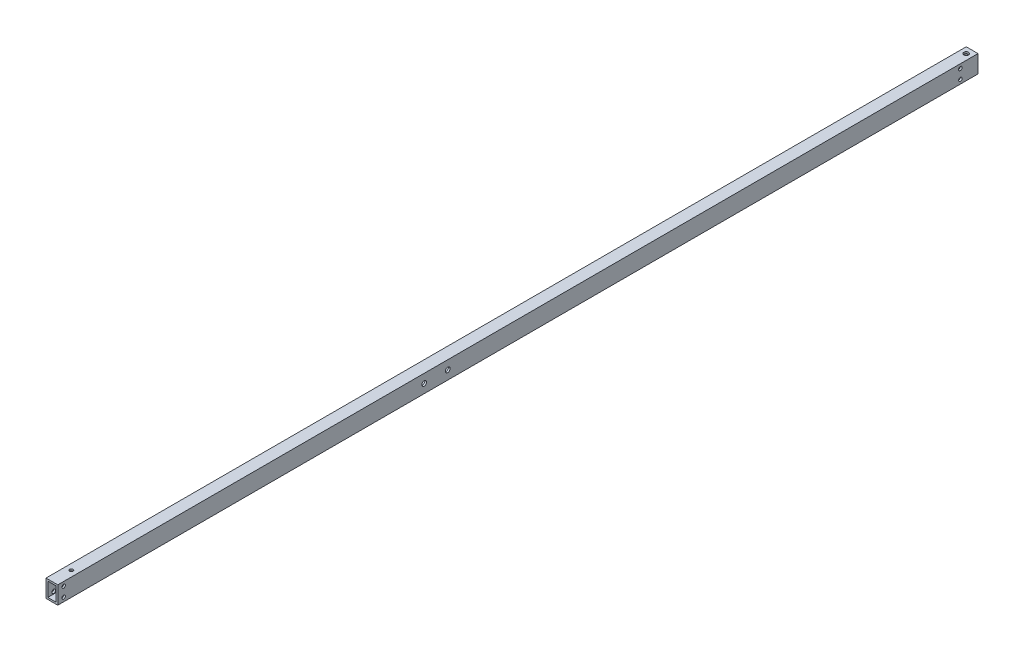
ISO-10303-21;
HEADER;
FILE_DESCRIPTION(('STEP AP214'),'2;1');
FILE_NAME('part.step','',(''),(''),'','','');
FILE_SCHEMA(('AUTOMOTIVE_DESIGN { 1 0 10303 214 1 1 1 1 }'));
ENDSEC;
DATA;
#1=APPLICATION_CONTEXT('core data for automotive mechanical design processes');
#2=APPLICATION_PROTOCOL_DEFINITION('international standard','automotive_design',2000,#1);
#3=PRODUCT_CONTEXT('',#1,'mechanical');
#4=PRODUCT('Part','Part','',(#3));
#5=PRODUCT_RELATED_PRODUCT_CATEGORY('part','',(#4));
#6=PRODUCT_DEFINITION_FORMATION('','',#4);
#7=PRODUCT_DEFINITION_CONTEXT('part definition',#1,'design');
#8=PRODUCT_DEFINITION('design','',#6,#7);
#9=PRODUCT_DEFINITION_SHAPE('','',#8);
#10=(LENGTH_UNIT() NAMED_UNIT(*) SI_UNIT(.MILLI.,.METRE.));
#11=(NAMED_UNIT(*) PLANE_ANGLE_UNIT() SI_UNIT($,.RADIAN.));
#12=(NAMED_UNIT(*) SI_UNIT($,.STERADIAN.) SOLID_ANGLE_UNIT());
#13=UNCERTAINTY_MEASURE_WITH_UNIT(LENGTH_MEASURE(1.E-05),#10,'distance_accuracy_value','');
#14=(GEOMETRIC_REPRESENTATION_CONTEXT(3) GLOBAL_UNCERTAINTY_ASSIGNED_CONTEXT((#13)) GLOBAL_UNIT_ASSIGNED_CONTEXT((#10,
#11,#12)) REPRESENTATION_CONTEXT('',''));
#15=CARTESIAN_POINT('',(0.,0.,0.));
#16=DIRECTION('',(0.,0.,1.));
#17=DIRECTION('',(1.,0.,0.));
#18=AXIS2_PLACEMENT_3D('',#15,#16,#17);
#19=CARTESIAN_POINT('',(0.,0.,781.));
#20=DIRECTION('',(0.,0.,1.));
#21=DIRECTION('',(1.,0.,0.));
#22=AXIS2_PLACEMENT_3D('',#19,#20,#21);
#23=PLANE('',#22);
#24=DIRECTION('',(0.,1.,0.));
#25=VECTOR('',#24,1.);
#26=CARTESIAN_POINT('',(5.,-7.5,781.));
#27=LINE('',#26,#25);
#28=CARTESIAN_POINT('',(5.,-7.5,781.));
#29=VERTEX_POINT('',#28);
#30=CARTESIAN_POINT('',(5.,7.5,781.));
#31=VERTEX_POINT('',#30);
#32=EDGE_CURVE('E164',#29,#31,#27,.T.);
#33=ORIENTED_EDGE('',*,*,#32,.T.);
#34=DIRECTION('',(-1.,0.,0.));
#35=VECTOR('',#34,1.);
#36=CARTESIAN_POINT('',(-5.,7.5,781.));
#37=LINE('',#36,#35);
#38=CARTESIAN_POINT('',(-5.,7.5,781.));
#39=VERTEX_POINT('',#38);
#40=EDGE_CURVE('E167',#31,#39,#37,.T.);
#41=ORIENTED_EDGE('',*,*,#40,.T.);
#42=DIRECTION('',(0.,-1.,0.));
#43=VECTOR('',#42,1.);
#44=CARTESIAN_POINT('',(-5.,-7.5,781.));
#45=LINE('',#44,#43);
#46=CARTESIAN_POINT('',(-5.,-7.5,781.));
#47=VERTEX_POINT('',#46);
#48=EDGE_CURVE('E170',#39,#47,#45,.T.);
#49=ORIENTED_EDGE('',*,*,#48,.T.);
#50=DIRECTION('',(1.,0.,0.));
#51=VECTOR('',#50,1.);
#52=CARTESIAN_POINT('',(-5.,-7.5,781.));
#53=LINE('',#52,#51);
#54=EDGE_CURVE('E172',#47,#29,#53,.T.);
#55=ORIENTED_EDGE('',*,*,#54,.T.);
#56=EDGE_LOOP('',(#33,#41,#49,#55));
#57=FACE_BOUND('',#56,.T.);
#58=DIRECTION('',(-1.,0.,0.));
#59=VECTOR('',#58,1.);
#60=CARTESIAN_POINT('',(0.,6.,781.));
#61=LINE('',#60,#59);
#62=CARTESIAN_POINT('',(3.5,6.,781.));
#63=VERTEX_POINT('',#62);
#64=CARTESIAN_POINT('',(-3.5,6.,781.));
#65=VERTEX_POINT('',#64);
#66=EDGE_CURVE('E134',#63,#65,#61,.T.);
#67=ORIENTED_EDGE('',*,*,#66,.F.);
#68=DIRECTION('',(0.,1.,0.));
#69=VECTOR('',#68,1.);
#70=CARTESIAN_POINT('',(3.5,0.,781.));
#71=LINE('',#70,#69);
#72=CARTESIAN_POINT('',(3.5,-6.,781.));
#73=VERTEX_POINT('',#72);
#74=EDGE_CURVE('E126',#73,#63,#71,.T.);
#75=ORIENTED_EDGE('',*,*,#74,.F.);
#76=DIRECTION('',(1.,0.,0.));
#77=VECTOR('',#76,1.);
#78=CARTESIAN_POINT('',(0.,-6.,781.));
#79=LINE('',#78,#77);
#80=CARTESIAN_POINT('',(-3.5,-6.,781.));
#81=VERTEX_POINT('',#80);
#82=EDGE_CURVE('E148',#81,#73,#79,.T.);
#83=ORIENTED_EDGE('',*,*,#82,.F.);
#84=DIRECTION('',(0.,-1.,0.));
#85=VECTOR('',#84,1.);
#86=CARTESIAN_POINT('',(-3.5,0.,781.));
#87=LINE('',#86,#85);
#88=EDGE_CURVE('E146',#65,#81,#87,.T.);
#89=ORIENTED_EDGE('',*,*,#88,.F.);
#90=EDGE_LOOP('',(#67,#75,#83,#89));
#91=FACE_BOUND('',#90,.T.);
#92=ADVANCED_FACE('F59',(#57,#91),#23,.T.);
#93=CARTESIAN_POINT('',(0.,0.,0.));
#94=DIRECTION('',(0.,0.,1.));
#95=DIRECTION('',(1.,0.,0.));
#96=AXIS2_PLACEMENT_3D('',#93,#94,#95);
#97=PLANE('',#96);
#98=DIRECTION('',(0.,1.,0.));
#99=VECTOR('',#98,1.);
#100=CARTESIAN_POINT('',(5.,-7.5,0.));
#101=LINE('',#100,#99);
#102=CARTESIAN_POINT('',(5.,-7.5,0.));
#103=VERTEX_POINT('',#102);
#104=CARTESIAN_POINT('',(5.,7.5,0.));
#105=VERTEX_POINT('',#104);
#106=EDGE_CURVE('E142',#103,#105,#101,.T.);
#107=ORIENTED_EDGE('',*,*,#106,.F.);
#108=DIRECTION('',(1.,0.,0.));
#109=VECTOR('',#108,1.);
#110=CARTESIAN_POINT('',(-5.,-7.5,0.));
#111=LINE('',#110,#109);
#112=CARTESIAN_POINT('',(-5.,-7.5,0.));
#113=VERTEX_POINT('',#112);
#114=EDGE_CURVE('E168',#113,#103,#111,.T.);
#115=ORIENTED_EDGE('',*,*,#114,.F.);
#116=DIRECTION('',(0.,-1.,0.));
#117=VECTOR('',#116,1.);
#118=CARTESIAN_POINT('',(-5.,-7.5,0.));
#119=LINE('',#118,#117);
#120=CARTESIAN_POINT('',(-5.,7.5,0.));
#121=VERTEX_POINT('',#120);
#122=EDGE_CURVE('E179',#121,#113,#119,.T.);
#123=ORIENTED_EDGE('',*,*,#122,.F.);
#124=DIRECTION('',(-1.,0.,0.));
#125=VECTOR('',#124,1.);
#126=CARTESIAN_POINT('',(-5.,7.5,0.));
#127=LINE('',#126,#125);
#128=EDGE_CURVE('E177',#105,#121,#127,.T.);
#129=ORIENTED_EDGE('',*,*,#128,.F.);
#130=EDGE_LOOP('',(#107,#115,#123,#129));
#131=FACE_BOUND('',#130,.T.);
#132=DIRECTION('',(0.,1.,0.));
#133=VECTOR('',#132,1.);
#134=CARTESIAN_POINT('',(3.5,0.,0.));
#135=LINE('',#134,#133);
#136=CARTESIAN_POINT('',(3.5,-6.,0.));
#137=VERTEX_POINT('',#136);
#138=CARTESIAN_POINT('',(3.5,6.,0.));
#139=VERTEX_POINT('',#138);
#140=EDGE_CURVE('E84',#137,#139,#135,.T.);
#141=ORIENTED_EDGE('',*,*,#140,.T.);
#142=DIRECTION('',(-1.,0.,0.));
#143=VECTOR('',#142,1.);
#144=CARTESIAN_POINT('',(0.,6.,0.));
#145=LINE('',#144,#143);
#146=CARTESIAN_POINT('',(-3.5,6.,0.));
#147=VERTEX_POINT('',#146);
#148=EDGE_CURVE('E141',#139,#147,#145,.T.);
#149=ORIENTED_EDGE('',*,*,#148,.T.);
#150=DIRECTION('',(0.,-1.,0.));
#151=VECTOR('',#150,1.);
#152=CARTESIAN_POINT('',(-3.5,0.,0.));
#153=LINE('',#152,#151);
#154=CARTESIAN_POINT('',(-3.5,-6.,0.));
#155=VERTEX_POINT('',#154);
#156=EDGE_CURVE('E156',#147,#155,#153,.T.);
#157=ORIENTED_EDGE('',*,*,#156,.T.);
#158=DIRECTION('',(1.,0.,0.));
#159=VECTOR('',#158,1.);
#160=CARTESIAN_POINT('',(0.,-6.,0.));
#161=LINE('',#160,#159);
#162=EDGE_CURVE('E135',#155,#137,#161,.T.);
#163=ORIENTED_EDGE('',*,*,#162,.T.);
#164=EDGE_LOOP('',(#141,#149,#157,#163));
#165=FACE_BOUND('',#164,.T.);
#166=ADVANCED_FACE('F313',(#131,#165),#97,.F.);
#167=CARTESIAN_POINT('',(5.,-7.5,781.));
#168=DIRECTION('',(-1.,0.,0.));
#169=DIRECTION('',(0.,0.,1.));
#170=AXIS2_PLACEMENT_3D('',#167,#168,#169);
#171=PLANE('',#170);
#172=CARTESIAN_POINT('',(5.,4.,15.));
#173=DIRECTION('',(1.,0.,0.));
#174=DIRECTION('',(0.,0.,-1.));
#175=AXIS2_PLACEMENT_3D('',#172,#173,#174);
#176=CIRCLE('',#175,1.5);
#177=CARTESIAN_POINT('',(5.,4.,13.5));
#178=VERTEX_POINT('',#177);
#179=EDGE_CURVE('E248',#178,#178,#176,.T.);
#180=ORIENTED_EDGE('',*,*,#179,.F.);
#181=EDGE_LOOP('',(#180));
#182=FACE_BOUND('',#181,.T.);
#183=CARTESIAN_POINT('',(5.,-4.,15.));
#184=DIRECTION('',(1.,0.,0.));
#185=DIRECTION('',(0.,0.,1.));
#186=AXIS2_PLACEMENT_3D('',#183,#184,#185);
#187=CIRCLE('',#186,1.5);
#188=CARTESIAN_POINT('',(5.,-4.,16.5));
#189=VERTEX_POINT('',#188);
#190=EDGE_CURVE('E254',#189,#189,#187,.T.);
#191=ORIENTED_EDGE('',*,*,#190,.F.);
#192=EDGE_LOOP('',(#191));
#193=FACE_BOUND('',#192,.T.);
#194=CARTESIAN_POINT('',(5.,0.,470.));
#195=DIRECTION('',(1.,0.,0.));
#196=DIRECTION('',(0.,0.,-1.));
#197=AXIS2_PLACEMENT_3D('',#194,#195,#196);
#198=CIRCLE('',#197,2.);
#199=CARTESIAN_POINT('',(5.,0.,468.));
#200=VERTEX_POINT('',#199);
#201=EDGE_CURVE('E260',#200,#200,#198,.T.);
#202=ORIENTED_EDGE('',*,*,#201,.F.);
#203=EDGE_LOOP('',(#202));
#204=FACE_BOUND('',#203,.T.);
#205=CARTESIAN_POINT('',(5.,-4.,776.));
#206=DIRECTION('',(1.,0.,0.));
#207=DIRECTION('',(0.,0.,1.));
#208=AXIS2_PLACEMENT_3D('',#205,#206,#207);
#209=CIRCLE('',#208,1.49999999999997);
#210=CARTESIAN_POINT('',(5.,-4.,777.5));
#211=VERTEX_POINT('',#210);
#212=EDGE_CURVE('E241',#211,#211,#209,.T.);
#213=ORIENTED_EDGE('',*,*,#212,.F.);
#214=EDGE_LOOP('',(#213));
#215=FACE_BOUND('',#214,.T.);
#216=CARTESIAN_POINT('',(5.,0.,450.));
#217=DIRECTION('',(1.,0.,0.));
#218=DIRECTION('',(0.,0.,-1.));
#219=AXIS2_PLACEMENT_3D('',#216,#217,#218);
#220=CIRCLE('',#219,2.);
#221=CARTESIAN_POINT('',(5.,0.,448.));
#222=VERTEX_POINT('',#221);
#223=EDGE_CURVE('E237',#222,#222,#220,.T.);
#224=ORIENTED_EDGE('',*,*,#223,.F.);
#225=EDGE_LOOP('',(#224));
#226=FACE_BOUND('',#225,.T.);
#227=CARTESIAN_POINT('',(5.,4.,776.));
#228=DIRECTION('',(1.,0.,0.));
#229=DIRECTION('',(0.,0.,-1.));
#230=AXIS2_PLACEMENT_3D('',#227,#228,#229);
#231=CIRCLE('',#230,1.49999999999997);
#232=CARTESIAN_POINT('',(5.,4.,774.5));
#233=VERTEX_POINT('',#232);
#234=EDGE_CURVE('E247',#233,#233,#231,.T.);
#235=ORIENTED_EDGE('',*,*,#234,.F.);
#236=EDGE_LOOP('',(#235));
#237=FACE_BOUND('',#236,.T.);
#238=ORIENTED_EDGE('',*,*,#106,.T.);
#239=DIRECTION('',(0.,0.,-1.));
#240=VECTOR('',#239,1.);
#241=CARTESIAN_POINT('',(5.,7.5,781.));
#242=LINE('',#241,#240);
#243=EDGE_CURVE('E12',#31,#105,#242,.T.);
#244=ORIENTED_EDGE('',*,*,#243,.F.);
#245=ORIENTED_EDGE('',*,*,#32,.F.);
#246=DIRECTION('',(0.,0.,-1.));
#247=VECTOR('',#246,1.);
#248=CARTESIAN_POINT('',(5.,-7.5,781.));
#249=LINE('',#248,#247);
#250=EDGE_CURVE('E174',#29,#103,#249,.T.);
#251=ORIENTED_EDGE('',*,*,#250,.T.);
#252=EDGE_LOOP('',(#238,#244,#245,#251));
#253=FACE_BOUND('',#252,.T.);
#254=ADVANCED_FACE('F61',(#182,#193,#204,#215,#226,#237,#253),#171,.F.);
#255=CARTESIAN_POINT('',(-5.,7.5,781.));
#256=DIRECTION('',(0.,-1.,0.));
#257=DIRECTION('',(0.,0.,-1.));
#258=AXIS2_PLACEMENT_3D('',#255,#256,#257);
#259=PLANE('',#258);
#260=CARTESIAN_POINT('',(0.,7.5,5.));
#261=DIRECTION('',(0.,1.,0.));
#262=DIRECTION('',(0.,0.,1.));
#263=AXIS2_PLACEMENT_3D('',#260,#261,#262);
#264=CIRCLE('',#263,2.);
#265=CARTESIAN_POINT('',(0.,7.5,7.));
#266=VERTEX_POINT('',#265);
#267=EDGE_CURVE('E221',#266,#266,#264,.T.);
#268=ORIENTED_EDGE('',*,*,#267,.F.);
#269=EDGE_LOOP('',(#268));
#270=FACE_BOUND('',#269,.T.);
#271=CARTESIAN_POINT('',(0.,7.5,764.5));
#272=DIRECTION('',(0.,1.,0.));
#273=DIRECTION('',(0.,0.,1.));
#274=AXIS2_PLACEMENT_3D('',#271,#272,#273);
#275=CIRCLE('',#274,1.5);
#276=CARTESIAN_POINT('',(0.,7.5,766.));
#277=VERTEX_POINT('',#276);
#278=EDGE_CURVE('E231',#277,#277,#275,.T.);
#279=ORIENTED_EDGE('',*,*,#278,.F.);
#280=EDGE_LOOP('',(#279));
#281=FACE_BOUND('',#280,.T.);
#282=ORIENTED_EDGE('',*,*,#128,.T.);
#283=DIRECTION('',(0.,0.,-1.));
#284=VECTOR('',#283,1.);
#285=CARTESIAN_POINT('',(-5.,7.5,781.));
#286=LINE('',#285,#284);
#287=EDGE_CURVE('E68',#39,#121,#286,.T.);
#288=ORIENTED_EDGE('',*,*,#287,.F.);
#289=ORIENTED_EDGE('',*,*,#40,.F.);
#290=ORIENTED_EDGE('',*,*,#243,.T.);
#291=EDGE_LOOP('',(#282,#288,#289,#290));
#292=FACE_BOUND('',#291,.T.);
#293=ADVANCED_FACE('F312',(#270,#281,#292),#259,.F.);
#294=CARTESIAN_POINT('',(-5.,-7.5,781.));
#295=DIRECTION('',(1.,0.,0.));
#296=DIRECTION('',(0.,0.,-1.));
#297=AXIS2_PLACEMENT_3D('',#294,#295,#296);
#298=PLANE('',#297);
#299=CARTESIAN_POINT('',(-5.,4.,15.));
#300=DIRECTION('',(1.,0.,0.));
#301=DIRECTION('',(0.,0.,-1.));
#302=AXIS2_PLACEMENT_3D('',#299,#300,#301);
#303=CIRCLE('',#302,1.5);
#304=CARTESIAN_POINT('',(-5.,4.,13.5));
#305=VERTEX_POINT('',#304);
#306=EDGE_CURVE('E244',#305,#305,#303,.T.);
#307=ORIENTED_EDGE('',*,*,#306,.T.);
#308=EDGE_LOOP('',(#307));
#309=FACE_BOUND('',#308,.T.);
#310=CARTESIAN_POINT('',(-5.,-4.,15.));
#311=DIRECTION('',(1.,0.,0.));
#312=DIRECTION('',(0.,0.,1.));
#313=AXIS2_PLACEMENT_3D('',#310,#311,#312);
#314=CIRCLE('',#313,1.5);
#315=CARTESIAN_POINT('',(-5.,-4.,16.5));
#316=VERTEX_POINT('',#315);
#317=EDGE_CURVE('E251',#316,#316,#314,.T.);
#318=ORIENTED_EDGE('',*,*,#317,.T.);
#319=EDGE_LOOP('',(#318));
#320=FACE_BOUND('',#319,.T.);
#321=CARTESIAN_POINT('',(-5.,0.,470.));
#322=DIRECTION('',(1.,0.,0.));
#323=DIRECTION('',(0.,0.,-1.));
#324=AXIS2_PLACEMENT_3D('',#321,#322,#323);
#325=CIRCLE('',#324,2.);
#326=CARTESIAN_POINT('',(-5.,0.,468.));
#327=VERTEX_POINT('',#326);
#328=EDGE_CURVE('E257',#327,#327,#325,.T.);
#329=ORIENTED_EDGE('',*,*,#328,.T.);
#330=EDGE_LOOP('',(#329));
#331=FACE_BOUND('',#330,.T.);
#332=CARTESIAN_POINT('',(-5.,-4.,776.));
#333=DIRECTION('',(1.,0.,0.));
#334=DIRECTION('',(0.,0.,1.));
#335=AXIS2_PLACEMENT_3D('',#332,#333,#334);
#336=CIRCLE('',#335,1.49999999999997);
#337=CARTESIAN_POINT('',(-5.,-4.,777.5));
#338=VERTEX_POINT('',#337);
#339=EDGE_CURVE('E263',#338,#338,#336,.T.);
#340=ORIENTED_EDGE('',*,*,#339,.T.);
#341=EDGE_LOOP('',(#340));
#342=FACE_BOUND('',#341,.T.);
#343=CARTESIAN_POINT('',(-5.,0.,450.));
#344=DIRECTION('',(1.,0.,0.));
#345=DIRECTION('',(0.,0.,-1.));
#346=AXIS2_PLACEMENT_3D('',#343,#344,#345);
#347=CIRCLE('',#346,2.);
#348=CARTESIAN_POINT('',(-5.,0.,448.));
#349=VERTEX_POINT('',#348);
#350=EDGE_CURVE('E238',#349,#349,#347,.T.);
#351=ORIENTED_EDGE('',*,*,#350,.T.);
#352=EDGE_LOOP('',(#351));
#353=FACE_BOUND('',#352,.T.);
#354=CARTESIAN_POINT('',(-5.,4.,776.));
#355=DIRECTION('',(1.,0.,0.));
#356=DIRECTION('',(0.,0.,-1.));
#357=AXIS2_PLACEMENT_3D('',#354,#355,#356);
#358=CIRCLE('',#357,1.49999999999997);
#359=CARTESIAN_POINT('',(-5.,4.,774.5));
#360=VERTEX_POINT('',#359);
#361=EDGE_CURVE('E193',#360,#360,#358,.T.);
#362=ORIENTED_EDGE('',*,*,#361,.T.);
#363=EDGE_LOOP('',(#362));
#364=FACE_BOUND('',#363,.T.);
#365=ORIENTED_EDGE('',*,*,#122,.T.);
#366=DIRECTION('',(0.,0.,-1.));
#367=VECTOR('',#366,1.);
#368=CARTESIAN_POINT('',(-5.,-7.5,781.));
#369=LINE('',#368,#367);
#370=EDGE_CURVE('E184',#47,#113,#369,.T.);
#371=ORIENTED_EDGE('',*,*,#370,.F.);
#372=ORIENTED_EDGE('',*,*,#48,.F.);
#373=ORIENTED_EDGE('',*,*,#287,.T.);
#374=EDGE_LOOP('',(#365,#371,#372,#373));
#375=FACE_BOUND('',#374,.T.);
#376=ADVANCED_FACE('F331',(#309,#320,#331,#342,#353,#364,#375),#298,.F.);
#377=CARTESIAN_POINT('',(-5.,-7.5,781.));
#378=DIRECTION('',(0.,1.,0.));
#379=DIRECTION('',(0.,0.,1.));
#380=AXIS2_PLACEMENT_3D('',#377,#378,#379);
#381=PLANE('',#380);
#382=CARTESIAN_POINT('',(0.,-7.5,5.));
#383=DIRECTION('',(0.,1.,0.));
#384=DIRECTION('',(0.,0.,1.));
#385=AXIS2_PLACEMENT_3D('',#382,#383,#384);
#386=CIRCLE('',#385,2.);
#387=CARTESIAN_POINT('',(0.,-7.5,7.));
#388=VERTEX_POINT('',#387);
#389=EDGE_CURVE('E215',#388,#388,#386,.T.);
#390=ORIENTED_EDGE('',*,*,#389,.T.);
#391=EDGE_LOOP('',(#390));
#392=FACE_BOUND('',#391,.T.);
#393=CARTESIAN_POINT('',(0.,-7.5,764.5));
#394=DIRECTION('',(0.,1.,0.));
#395=DIRECTION('',(0.,0.,1.));
#396=AXIS2_PLACEMENT_3D('',#393,#394,#395);
#397=CIRCLE('',#396,1.5);
#398=CARTESIAN_POINT('',(0.,-7.5,766.));
#399=VERTEX_POINT('',#398);
#400=EDGE_CURVE('E226',#399,#399,#397,.T.);
#401=ORIENTED_EDGE('',*,*,#400,.T.);
#402=EDGE_LOOP('',(#401));
#403=FACE_BOUND('',#402,.T.);
#404=ORIENTED_EDGE('',*,*,#114,.T.);
#405=ORIENTED_EDGE('',*,*,#250,.F.);
#406=ORIENTED_EDGE('',*,*,#54,.F.);
#407=ORIENTED_EDGE('',*,*,#370,.T.);
#408=EDGE_LOOP('',(#404,#405,#406,#407));
#409=FACE_BOUND('',#408,.T.);
#410=ADVANCED_FACE('F289',(#392,#403,#409),#381,.F.);
#411=CARTESIAN_POINT('',(3.5,0.,781.));
#412=DIRECTION('',(-1.,0.,0.));
#413=DIRECTION('',(0.,0.,1.));
#414=AXIS2_PLACEMENT_3D('',#411,#412,#413);
#415=PLANE('',#414);
#416=CARTESIAN_POINT('',(3.5,4.,15.));
#417=DIRECTION('',(-1.,0.,0.));
#418=DIRECTION('',(0.,0.,1.));
#419=AXIS2_PLACEMENT_3D('',#416,#417,#418);
#420=CIRCLE('',#419,1.5);
#421=CARTESIAN_POINT('',(3.5,4.,16.5));
#422=VERTEX_POINT('',#421);
#423=EDGE_CURVE('E154',#422,#422,#420,.T.);
#424=ORIENTED_EDGE('',*,*,#423,.F.);
#425=EDGE_LOOP('',(#424));
#426=FACE_BOUND('',#425,.T.);
#427=CARTESIAN_POINT('',(3.5,-4.,15.));
#428=DIRECTION('',(-1.,0.,0.));
#429=DIRECTION('',(0.,0.,1.));
#430=AXIS2_PLACEMENT_3D('',#427,#428,#429);
#431=CIRCLE('',#430,1.5);
#432=CARTESIAN_POINT('',(3.5,-4.,16.5));
#433=VERTEX_POINT('',#432);
#434=EDGE_CURVE('E209',#433,#433,#431,.T.);
#435=ORIENTED_EDGE('',*,*,#434,.F.);
#436=EDGE_LOOP('',(#435));
#437=FACE_BOUND('',#436,.T.);
#438=CARTESIAN_POINT('',(3.5,0.,470.));
#439=DIRECTION('',(-1.,0.,0.));
#440=DIRECTION('',(0.,0.,1.));
#441=AXIS2_PLACEMENT_3D('',#438,#439,#440);
#442=CIRCLE('',#441,2.);
#443=CARTESIAN_POINT('',(3.5,0.,472.));
#444=VERTEX_POINT('',#443);
#445=EDGE_CURVE('E205',#444,#444,#442,.T.);
#446=ORIENTED_EDGE('',*,*,#445,.F.);
#447=EDGE_LOOP('',(#446));
#448=FACE_BOUND('',#447,.T.);
#449=CARTESIAN_POINT('',(3.5,-4.,776.));
#450=DIRECTION('',(-1.,0.,0.));
#451=DIRECTION('',(0.,0.,1.));
#452=AXIS2_PLACEMENT_3D('',#449,#450,#451);
#453=CIRCLE('',#452,1.49999999999997);
#454=CARTESIAN_POINT('',(3.5,-4.,777.5));
#455=VERTEX_POINT('',#454);
#456=EDGE_CURVE('E201',#455,#455,#453,.T.);
#457=ORIENTED_EDGE('',*,*,#456,.F.);
#458=EDGE_LOOP('',(#457));
#459=FACE_BOUND('',#458,.T.);
#460=CARTESIAN_POINT('',(3.5,0.,450.));
#461=DIRECTION('',(-1.,0.,0.));
#462=DIRECTION('',(0.,0.,1.));
#463=AXIS2_PLACEMENT_3D('',#460,#461,#462);
#464=CIRCLE('',#463,2.);
#465=CARTESIAN_POINT('',(3.5,0.,452.));
#466=VERTEX_POINT('',#465);
#467=EDGE_CURVE('E197',#466,#466,#464,.T.);
#468=ORIENTED_EDGE('',*,*,#467,.F.);
#469=EDGE_LOOP('',(#468));
#470=FACE_BOUND('',#469,.T.);
#471=CARTESIAN_POINT('',(3.5,4.,776.));
#472=DIRECTION('',(-1.,0.,0.));
#473=DIRECTION('',(0.,0.,1.));
#474=AXIS2_PLACEMENT_3D('',#471,#472,#473);
#475=CIRCLE('',#474,1.49999999999997);
#476=CARTESIAN_POINT('',(3.5,4.,777.5));
#477=VERTEX_POINT('',#476);
#478=EDGE_CURVE('E192',#477,#477,#475,.T.);
#479=ORIENTED_EDGE('',*,*,#478,.F.);
#480=EDGE_LOOP('',(#479));
#481=FACE_BOUND('',#480,.T.);
#482=ORIENTED_EDGE('',*,*,#140,.F.);
#483=DIRECTION('',(0.,0.,-1.));
#484=VECTOR('',#483,1.);
#485=CARTESIAN_POINT('',(3.5,-6.,781.));
#486=LINE('',#485,#484);
#487=EDGE_CURVE('E130',#73,#137,#486,.T.);
#488=ORIENTED_EDGE('',*,*,#487,.F.);
#489=ORIENTED_EDGE('',*,*,#74,.T.);
#490=DIRECTION('',(0.,0.,-1.));
#491=VECTOR('',#490,1.);
#492=CARTESIAN_POINT('',(3.5,6.,781.));
#493=LINE('',#492,#491);
#494=EDGE_CURVE('E129',#63,#139,#493,.T.);
#495=ORIENTED_EDGE('',*,*,#494,.T.);
#496=EDGE_LOOP('',(#482,#488,#489,#495));
#497=FACE_BOUND('',#496,.T.);
#498=ADVANCED_FACE('F128',(#426,#437,#448,#459,#470,#481,#497),#415,.T.);
#499=CARTESIAN_POINT('',(0.,6.,781.));
#500=DIRECTION('',(0.,-1.,0.));
#501=DIRECTION('',(0.,0.,-1.));
#502=AXIS2_PLACEMENT_3D('',#499,#500,#501);
#503=PLANE('',#502);
#504=CARTESIAN_POINT('',(0.,6.,5.));
#505=DIRECTION('',(0.,-1.,0.));
#506=DIRECTION('',(0.,0.,-1.));
#507=AXIS2_PLACEMENT_3D('',#504,#505,#506);
#508=CIRCLE('',#507,2.);
#509=CARTESIAN_POINT('',(0.,6.,3.));
#510=VERTEX_POINT('',#509);
#511=EDGE_CURVE('E234',#510,#510,#508,.T.);
#512=ORIENTED_EDGE('',*,*,#511,.F.);
#513=EDGE_LOOP('',(#512));
#514=FACE_BOUND('',#513,.T.);
#515=CARTESIAN_POINT('',(0.,6.,764.5));
#516=DIRECTION('',(0.,-1.,0.));
#517=DIRECTION('',(0.,0.,-1.));
#518=AXIS2_PLACEMENT_3D('',#515,#516,#517);
#519=CIRCLE('',#518,1.5);
#520=CARTESIAN_POINT('',(0.,6.,763.));
#521=VERTEX_POINT('',#520);
#522=EDGE_CURVE('E214',#521,#521,#519,.T.);
#523=ORIENTED_EDGE('',*,*,#522,.F.);
#524=EDGE_LOOP('',(#523));
#525=FACE_BOUND('',#524,.T.);
#526=ORIENTED_EDGE('',*,*,#148,.F.);
#527=ORIENTED_EDGE('',*,*,#494,.F.);
#528=ORIENTED_EDGE('',*,*,#66,.T.);
#529=DIRECTION('',(0.,0.,-1.));
#530=VECTOR('',#529,1.);
#531=CARTESIAN_POINT('',(-3.5,6.,781.));
#532=LINE('',#531,#530);
#533=EDGE_CURVE('E143',#65,#147,#532,.T.);
#534=ORIENTED_EDGE('',*,*,#533,.T.);
#535=EDGE_LOOP('',(#526,#527,#528,#534));
#536=FACE_BOUND('',#535,.T.);
#537=ADVANCED_FACE('F138',(#514,#525,#536),#503,.T.);
#538=CARTESIAN_POINT('',(-3.5,0.,781.));
#539=DIRECTION('',(1.,0.,0.));
#540=DIRECTION('',(0.,0.,-1.));
#541=AXIS2_PLACEMENT_3D('',#538,#539,#540);
#542=PLANE('',#541);
#543=CARTESIAN_POINT('',(-3.5,4.,15.));
#544=DIRECTION('',(1.,0.,0.));
#545=DIRECTION('',(0.,0.,-1.));
#546=AXIS2_PLACEMENT_3D('',#543,#544,#545);
#547=CIRCLE('',#546,1.5);
#548=CARTESIAN_POINT('',(-3.5,4.,13.5));
#549=VERTEX_POINT('',#548);
#550=EDGE_CURVE('E210',#549,#549,#547,.T.);
#551=ORIENTED_EDGE('',*,*,#550,.F.);
#552=EDGE_LOOP('',(#551));
#553=FACE_BOUND('',#552,.T.);
#554=CARTESIAN_POINT('',(-3.5,-4.,15.));
#555=DIRECTION('',(1.,0.,0.));
#556=DIRECTION('',(0.,0.,-1.));
#557=AXIS2_PLACEMENT_3D('',#554,#555,#556);
#558=CIRCLE('',#557,1.5);
#559=CARTESIAN_POINT('',(-3.5,-4.,13.5));
#560=VERTEX_POINT('',#559);
#561=EDGE_CURVE('E206',#560,#560,#558,.T.);
#562=ORIENTED_EDGE('',*,*,#561,.F.);
#563=EDGE_LOOP('',(#562));
#564=FACE_BOUND('',#563,.T.);
#565=CARTESIAN_POINT('',(-3.5,0.,470.));
#566=DIRECTION('',(1.,0.,0.));
#567=DIRECTION('',(0.,0.,-1.));
#568=AXIS2_PLACEMENT_3D('',#565,#566,#567);
#569=CIRCLE('',#568,2.);
#570=CARTESIAN_POINT('',(-3.5,0.,468.));
#571=VERTEX_POINT('',#570);
#572=EDGE_CURVE('E202',#571,#571,#569,.T.);
#573=ORIENTED_EDGE('',*,*,#572,.F.);
#574=EDGE_LOOP('',(#573));
#575=FACE_BOUND('',#574,.T.);
#576=CARTESIAN_POINT('',(-3.5,-4.,776.));
#577=DIRECTION('',(1.,0.,0.));
#578=DIRECTION('',(0.,0.,-1.));
#579=AXIS2_PLACEMENT_3D('',#576,#577,#578);
#580=CIRCLE('',#579,1.49999999999997);
#581=CARTESIAN_POINT('',(-3.5,-4.,774.5));
#582=VERTEX_POINT('',#581);
#583=EDGE_CURVE('E198',#582,#582,#580,.T.);
#584=ORIENTED_EDGE('',*,*,#583,.F.);
#585=EDGE_LOOP('',(#584));
#586=FACE_BOUND('',#585,.T.);
#587=CARTESIAN_POINT('',(-3.5,0.,450.));
#588=DIRECTION('',(1.,0.,0.));
#589=DIRECTION('',(0.,0.,-1.));
#590=AXIS2_PLACEMENT_3D('',#587,#588,#589);
#591=CIRCLE('',#590,2.);
#592=CARTESIAN_POINT('',(-3.5,0.,448.));
#593=VERTEX_POINT('',#592);
#594=EDGE_CURVE('E194',#593,#593,#591,.T.);
#595=ORIENTED_EDGE('',*,*,#594,.F.);
#596=EDGE_LOOP('',(#595));
#597=FACE_BOUND('',#596,.T.);
#598=CARTESIAN_POINT('',(-3.5,4.,776.));
#599=DIRECTION('',(1.,0.,0.));
#600=DIRECTION('',(0.,0.,-1.));
#601=AXIS2_PLACEMENT_3D('',#598,#599,#600);
#602=CIRCLE('',#601,1.49999999999997);
#603=CARTESIAN_POINT('',(-3.5,4.,774.5));
#604=VERTEX_POINT('',#603);
#605=EDGE_CURVE('E189',#604,#604,#602,.T.);
#606=ORIENTED_EDGE('',*,*,#605,.F.);
#607=EDGE_LOOP('',(#606));
#608=FACE_BOUND('',#607,.T.);
#609=ORIENTED_EDGE('',*,*,#156,.F.);
#610=ORIENTED_EDGE('',*,*,#533,.F.);
#611=ORIENTED_EDGE('',*,*,#88,.T.);
#612=DIRECTION('',(0.,0.,-1.));
#613=VECTOR('',#612,1.);
#614=CARTESIAN_POINT('',(-3.5,-6.,781.));
#615=LINE('',#614,#613);
#616=EDGE_CURVE('E76',#81,#155,#615,.T.);
#617=ORIENTED_EDGE('',*,*,#616,.T.);
#618=EDGE_LOOP('',(#609,#610,#611,#617));
#619=FACE_BOUND('',#618,.T.);
#620=ADVANCED_FACE('F351',(#553,#564,#575,#586,#597,#608,#619),#542,.T.);
#621=CARTESIAN_POINT('',(0.,-6.,781.));
#622=DIRECTION('',(0.,1.,0.));
#623=DIRECTION('',(0.,0.,1.));
#624=AXIS2_PLACEMENT_3D('',#621,#622,#623);
#625=PLANE('',#624);
#626=CARTESIAN_POINT('',(0.,-6.,5.));
#627=DIRECTION('',(0.,1.,0.));
#628=DIRECTION('',(0.,0.,1.));
#629=AXIS2_PLACEMENT_3D('',#626,#627,#628);
#630=CIRCLE('',#629,2.);
#631=CARTESIAN_POINT('',(0.,-6.,7.));
#632=VERTEX_POINT('',#631);
#633=EDGE_CURVE('E63',#632,#632,#630,.T.);
#634=ORIENTED_EDGE('',*,*,#633,.F.);
#635=EDGE_LOOP('',(#634));
#636=FACE_BOUND('',#635,.T.);
#637=CARTESIAN_POINT('',(0.,-6.,764.5));
#638=DIRECTION('',(0.,1.,0.));
#639=DIRECTION('',(0.,0.,1.));
#640=AXIS2_PLACEMENT_3D('',#637,#638,#639);
#641=CIRCLE('',#640,1.5);
#642=CARTESIAN_POINT('',(0.,-6.,766.));
#643=VERTEX_POINT('',#642);
#644=EDGE_CURVE('E212',#643,#643,#641,.T.);
#645=ORIENTED_EDGE('',*,*,#644,.F.);
#646=EDGE_LOOP('',(#645));
#647=FACE_BOUND('',#646,.T.);
#648=ORIENTED_EDGE('',*,*,#162,.F.);
#649=ORIENTED_EDGE('',*,*,#616,.F.);
#650=ORIENTED_EDGE('',*,*,#82,.T.);
#651=ORIENTED_EDGE('',*,*,#487,.T.);
#652=EDGE_LOOP('',(#648,#649,#650,#651));
#653=FACE_BOUND('',#652,.T.);
#654=ADVANCED_FACE('F355',(#636,#647,#653),#625,.T.);
#655=CARTESIAN_POINT('',(-5.,4.,776.));
#656=DIRECTION('',(1.,0.,0.));
#657=DIRECTION('',(0.,0.,-1.));
#658=AXIS2_PLACEMENT_3D('',#655,#656,#657);
#659=CYLINDRICAL_SURFACE('',#658,1.49999999999997);
#660=ORIENTED_EDGE('',*,*,#605,.T.);
#661=EDGE_LOOP('',(#660));
#662=FACE_BOUND('',#661,.T.);
#663=ORIENTED_EDGE('',*,*,#361,.F.);
#664=EDGE_LOOP('',(#663));
#665=FACE_BOUND('',#664,.T.);
#666=ADVANCED_FACE('F307',(#662,#665),#659,.F.);
#667=CARTESIAN_POINT('',(-5.,0.,450.));
#668=DIRECTION('',(1.,0.,0.));
#669=DIRECTION('',(0.,0.,-1.));
#670=AXIS2_PLACEMENT_3D('',#667,#668,#669);
#671=CYLINDRICAL_SURFACE('',#670,2.);
#672=ORIENTED_EDGE('',*,*,#594,.T.);
#673=EDGE_LOOP('',(#672));
#674=FACE_BOUND('',#673,.T.);
#675=ORIENTED_EDGE('',*,*,#350,.F.);
#676=EDGE_LOOP('',(#675));
#677=FACE_BOUND('',#676,.T.);
#678=ADVANCED_FACE('F361',(#674,#677),#671,.F.);
#679=CARTESIAN_POINT('',(-5.,-4.,776.));
#680=DIRECTION('',(1.,0.,0.));
#681=DIRECTION('',(0.,0.,-1.));
#682=AXIS2_PLACEMENT_3D('',#679,#680,#681);
#683=CYLINDRICAL_SURFACE('',#682,1.49999999999997);
#684=ORIENTED_EDGE('',*,*,#583,.T.);
#685=EDGE_LOOP('',(#684));
#686=FACE_BOUND('',#685,.T.);
#687=ORIENTED_EDGE('',*,*,#339,.F.);
#688=EDGE_LOOP('',(#687));
#689=FACE_BOUND('',#688,.T.);
#690=ADVANCED_FACE('F363',(#686,#689),#683,.F.);
#691=CARTESIAN_POINT('',(-5.,0.,470.));
#692=DIRECTION('',(1.,0.,0.));
#693=DIRECTION('',(0.,0.,-1.));
#694=AXIS2_PLACEMENT_3D('',#691,#692,#693);
#695=CYLINDRICAL_SURFACE('',#694,2.);
#696=ORIENTED_EDGE('',*,*,#572,.T.);
#697=EDGE_LOOP('',(#696));
#698=FACE_BOUND('',#697,.T.);
#699=ORIENTED_EDGE('',*,*,#328,.F.);
#700=EDGE_LOOP('',(#699));
#701=FACE_BOUND('',#700,.T.);
#702=ADVANCED_FACE('F366',(#698,#701),#695,.F.);
#703=CARTESIAN_POINT('',(-5.,-4.,15.));
#704=DIRECTION('',(1.,0.,0.));
#705=DIRECTION('',(0.,0.,-1.));
#706=AXIS2_PLACEMENT_3D('',#703,#704,#705);
#707=CYLINDRICAL_SURFACE('',#706,1.5);
#708=ORIENTED_EDGE('',*,*,#561,.T.);
#709=EDGE_LOOP('',(#708));
#710=FACE_BOUND('',#709,.T.);
#711=ORIENTED_EDGE('',*,*,#317,.F.);
#712=EDGE_LOOP('',(#711));
#713=FACE_BOUND('',#712,.T.);
#714=ADVANCED_FACE('F371',(#710,#713),#707,.F.);
#715=CARTESIAN_POINT('',(-5.,4.,15.));
#716=DIRECTION('',(1.,0.,0.));
#717=DIRECTION('',(0.,0.,-1.));
#718=AXIS2_PLACEMENT_3D('',#715,#716,#717);
#719=CYLINDRICAL_SURFACE('',#718,1.5);
#720=ORIENTED_EDGE('',*,*,#550,.T.);
#721=EDGE_LOOP('',(#720));
#722=FACE_BOUND('',#721,.T.);
#723=ORIENTED_EDGE('',*,*,#306,.F.);
#724=EDGE_LOOP('',(#723));
#725=FACE_BOUND('',#724,.T.);
#726=ADVANCED_FACE('F305',(#722,#725),#719,.F.);
#727=ORIENTED_EDGE('',*,*,#478,.T.);
#728=EDGE_LOOP('',(#727));
#729=FACE_BOUND('',#728,.T.);
#730=ORIENTED_EDGE('',*,*,#234,.T.);
#731=EDGE_LOOP('',(#730));
#732=FACE_BOUND('',#731,.T.);
#733=ADVANCED_FACE('F301',(#729,#732),#659,.F.);
#734=ORIENTED_EDGE('',*,*,#467,.T.);
#735=EDGE_LOOP('',(#734));
#736=FACE_BOUND('',#735,.T.);
#737=ORIENTED_EDGE('',*,*,#223,.T.);
#738=EDGE_LOOP('',(#737));
#739=FACE_BOUND('',#738,.T.);
#740=ADVANCED_FACE('F304',(#736,#739),#671,.F.);
#741=ORIENTED_EDGE('',*,*,#456,.T.);
#742=EDGE_LOOP('',(#741));
#743=FACE_BOUND('',#742,.T.);
#744=ORIENTED_EDGE('',*,*,#212,.T.);
#745=EDGE_LOOP('',(#744));
#746=FACE_BOUND('',#745,.T.);
#747=ADVANCED_FACE('F368',(#743,#746),#683,.F.);
#748=ORIENTED_EDGE('',*,*,#445,.T.);
#749=EDGE_LOOP('',(#748));
#750=FACE_BOUND('',#749,.T.);
#751=ORIENTED_EDGE('',*,*,#201,.T.);
#752=EDGE_LOOP('',(#751));
#753=FACE_BOUND('',#752,.T.);
#754=ADVANCED_FACE('F373',(#750,#753),#695,.F.);
#755=ORIENTED_EDGE('',*,*,#434,.T.);
#756=EDGE_LOOP('',(#755));
#757=FACE_BOUND('',#756,.T.);
#758=ORIENTED_EDGE('',*,*,#190,.T.);
#759=EDGE_LOOP('',(#758));
#760=FACE_BOUND('',#759,.T.);
#761=ADVANCED_FACE('F377',(#757,#760),#707,.F.);
#762=ORIENTED_EDGE('',*,*,#423,.T.);
#763=EDGE_LOOP('',(#762));
#764=FACE_BOUND('',#763,.T.);
#765=ORIENTED_EDGE('',*,*,#179,.T.);
#766=EDGE_LOOP('',(#765));
#767=FACE_BOUND('',#766,.T.);
#768=ADVANCED_FACE('F284',(#764,#767),#719,.F.);
#769=CARTESIAN_POINT('',(0.,-7.5,764.5));
#770=DIRECTION('',(0.,1.,0.));
#771=DIRECTION('',(0.,0.,1.));
#772=AXIS2_PLACEMENT_3D('',#769,#770,#771);
#773=CYLINDRICAL_SURFACE('',#772,1.5);
#774=ORIENTED_EDGE('',*,*,#644,.T.);
#775=EDGE_LOOP('',(#774));
#776=FACE_BOUND('',#775,.T.);
#777=ORIENTED_EDGE('',*,*,#400,.F.);
#778=EDGE_LOOP('',(#777));
#779=FACE_BOUND('',#778,.T.);
#780=ADVANCED_FACE('F384',(#776,#779),#773,.F.);
#781=CARTESIAN_POINT('',(0.,-7.5,5.));
#782=DIRECTION('',(0.,1.,0.));
#783=DIRECTION('',(0.,0.,1.));
#784=AXIS2_PLACEMENT_3D('',#781,#782,#783);
#785=CYLINDRICAL_SURFACE('',#784,2.);
#786=ORIENTED_EDGE('',*,*,#633,.T.);
#787=EDGE_LOOP('',(#786));
#788=FACE_BOUND('',#787,.T.);
#789=ORIENTED_EDGE('',*,*,#389,.F.);
#790=EDGE_LOOP('',(#789));
#791=FACE_BOUND('',#790,.T.);
#792=ADVANCED_FACE('F387',(#788,#791),#785,.F.);
#793=ORIENTED_EDGE('',*,*,#522,.T.);
#794=EDGE_LOOP('',(#793));
#795=FACE_BOUND('',#794,.T.);
#796=ORIENTED_EDGE('',*,*,#278,.T.);
#797=EDGE_LOOP('',(#796));
#798=FACE_BOUND('',#797,.T.);
#799=ADVANCED_FACE('F388',(#795,#798),#773,.F.);
#800=ORIENTED_EDGE('',*,*,#511,.T.);
#801=EDGE_LOOP('',(#800));
#802=FACE_BOUND('',#801,.T.);
#803=ORIENTED_EDGE('',*,*,#267,.T.);
#804=EDGE_LOOP('',(#803));
#805=FACE_BOUND('',#804,.T.);
#806=ADVANCED_FACE('F391',(#802,#805),#785,.F.);
#807=CLOSED_SHELL('',(#92,#166,#254,#293,#376,#410,#498,#537,#620,#654,#666,#678,#690,#702,#714,
#726,#733,#740,#747,#754,#761,#768,#780,#792,#799,#806));
#808=MANIFOLD_SOLID_BREP('B2',#807);
#809=ADVANCED_BREP_SHAPE_REPRESENTATION('',(#18,#808),#14);
#810=SHAPE_DEFINITION_REPRESENTATION(#9,#809);
ENDSEC;
END-ISO-10303-21;
